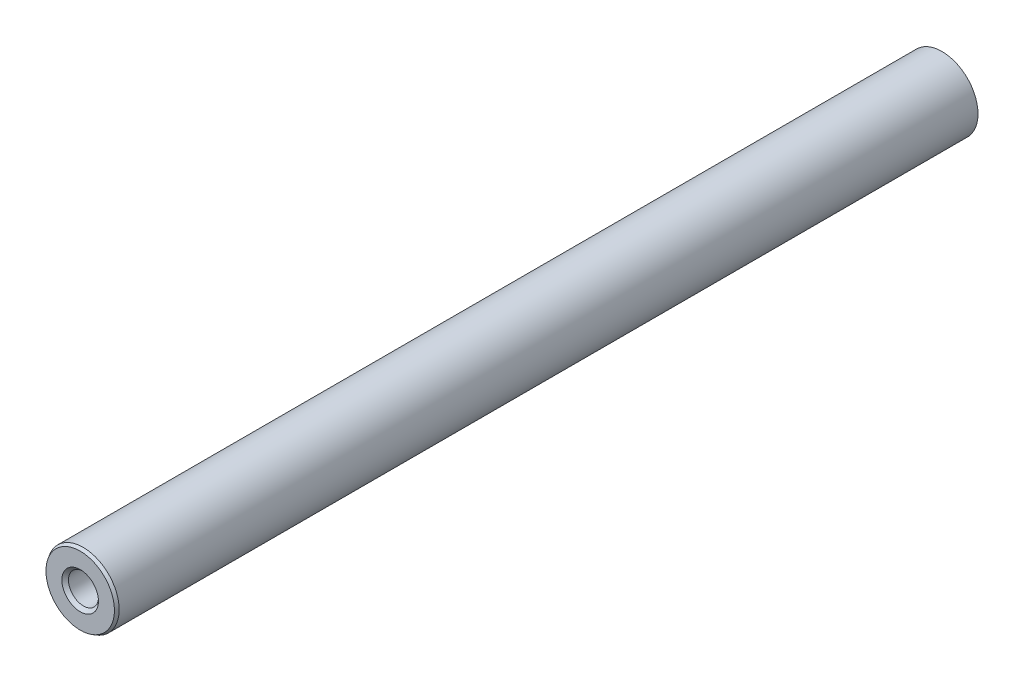
ISO-10303-21;
HEADER;
FILE_DESCRIPTION(('STEP AP214'),'2;1');
FILE_NAME('part.step','',(''),(''),'','','');
FILE_SCHEMA(('AUTOMOTIVE_DESIGN { 1 0 10303 214 1 1 1 1 }'));
ENDSEC;
DATA;
#1=APPLICATION_CONTEXT('core data for automotive mechanical design processes');
#2=APPLICATION_PROTOCOL_DEFINITION('international standard','automotive_design',2000,#1);
#3=PRODUCT_CONTEXT('',#1,'mechanical');
#4=PRODUCT('Part','Part','',(#3));
#5=PRODUCT_RELATED_PRODUCT_CATEGORY('part','',(#4));
#6=PRODUCT_DEFINITION_FORMATION('','',#4);
#7=PRODUCT_DEFINITION_CONTEXT('part definition',#1,'design');
#8=PRODUCT_DEFINITION('design','',#6,#7);
#9=PRODUCT_DEFINITION_SHAPE('','',#8);
#10=(LENGTH_UNIT() NAMED_UNIT(*) SI_UNIT(.MILLI.,.METRE.));
#11=(NAMED_UNIT(*) PLANE_ANGLE_UNIT() SI_UNIT($,.RADIAN.));
#12=(NAMED_UNIT(*) SI_UNIT($,.STERADIAN.) SOLID_ANGLE_UNIT());
#13=UNCERTAINTY_MEASURE_WITH_UNIT(LENGTH_MEASURE(1.E-05),#10,'distance_accuracy_value','');
#14=(GEOMETRIC_REPRESENTATION_CONTEXT(3) GLOBAL_UNCERTAINTY_ASSIGNED_CONTEXT((#13)) GLOBAL_UNIT_ASSIGNED_CONTEXT((#10,
#11,#12)) REPRESENTATION_CONTEXT('',''));
#15=CARTESIAN_POINT('',(0.,0.,0.));
#16=DIRECTION('',(0.,0.,1.));
#17=DIRECTION('',(1.,0.,0.));
#18=AXIS2_PLACEMENT_3D('',#15,#16,#17);
#19=CARTESIAN_POINT('',(0.,0.,36.));
#20=DIRECTION('',(0.,0.,-1.));
#21=DIRECTION('',(-1.,0.,0.));
#22=AXIS2_PLACEMENT_3D('',#19,#20,#21);
#23=CYLINDRICAL_SURFACE('',#22,3.);
#24=CARTESIAN_POINT('',(0.,0.,-35.8556624327026));
#25=DIRECTION('',(0.,0.,1.));
#26=DIRECTION('',(1.,0.,0.));
#27=AXIS2_PLACEMENT_3D('',#24,#25,#26);
#28=CIRCLE('',#27,3.);
#29=CARTESIAN_POINT('',(3.,0.,-35.8556624327026));
#30=VERTEX_POINT('',#29);
#31=EDGE_CURVE('E81',#30,#30,#28,.T.);
#32=ORIENTED_EDGE('',*,*,#31,.T.);
#33=EDGE_LOOP('',(#32));
#34=FACE_BOUND('',#33,.T.);
#35=CARTESIAN_POINT('',(0.,0.,35.75));
#36=DIRECTION('',(0.,0.,1.));
#37=DIRECTION('',(1.,0.,0.));
#38=AXIS2_PLACEMENT_3D('',#35,#36,#37);
#39=CIRCLE('',#38,3.);
#40=CARTESIAN_POINT('',(3.,0.,35.75));
#41=VERTEX_POINT('',#40);
#42=EDGE_CURVE('E78',#41,#41,#39,.F.);
#43=ORIENTED_EDGE('',*,*,#42,.T.);
#44=EDGE_LOOP('',(#43));
#45=FACE_BOUND('',#44,.T.);
#46=ADVANCED_FACE('F38',(#34,#45),#23,.T.);
#47=CARTESIAN_POINT('',(0.,0.,36.));
#48=DIRECTION('',(0.,0.,1.));
#49=DIRECTION('',(1.,0.,0.));
#50=AXIS2_PLACEMENT_3D('',#47,#48,#49);
#51=PLANE('',#50);
#52=CARTESIAN_POINT('',(0.,0.,36.));
#53=DIRECTION('',(0.,0.,1.));
#54=DIRECTION('',(1.,0.,0.));
#55=AXIS2_PLACEMENT_3D('',#52,#53,#54);
#56=CIRCLE('',#55,1.525);
#57=CARTESIAN_POINT('',(1.525,0.,36.));
#58=VERTEX_POINT('',#57);
#59=EDGE_CURVE('E62',#58,#58,#56,.T.);
#60=ORIENTED_EDGE('',*,*,#59,.F.);
#61=EDGE_LOOP('',(#60));
#62=FACE_BOUND('',#61,.T.);
#63=CARTESIAN_POINT('',(0.,0.,36.));
#64=DIRECTION('',(0.,0.,1.));
#65=DIRECTION('',(1.,0.,0.));
#66=AXIS2_PLACEMENT_3D('',#63,#64,#65);
#67=CIRCLE('',#66,2.8556624327026);
#68=CARTESIAN_POINT('',(2.8556624327026,0.,36.));
#69=VERTEX_POINT('',#68);
#70=EDGE_CURVE('E11',#69,#69,#67,.T.);
#71=ORIENTED_EDGE('',*,*,#70,.T.);
#72=EDGE_LOOP('',(#71));
#73=FACE_BOUND('',#72,.T.);
#74=ADVANCED_FACE('F95',(#62,#73),#51,.T.);
#75=CARTESIAN_POINT('',(0.,0.,-36.));
#76=DIRECTION('',(0.,0.,1.));
#77=DIRECTION('',(1.,0.,0.));
#78=AXIS2_PLACEMENT_3D('',#75,#76,#77);
#79=PLANE('',#78);
#80=CARTESIAN_POINT('',(0.,0.,-36.));
#81=DIRECTION('',(0.,0.,-1.));
#82=DIRECTION('',(-1.,0.,0.));
#83=AXIS2_PLACEMENT_3D('',#80,#81,#82);
#84=CIRCLE('',#83,1.525);
#85=CARTESIAN_POINT('',(-1.525,0.,-36.));
#86=VERTEX_POINT('',#85);
#87=EDGE_CURVE('E69',#86,#86,#84,.T.);
#88=ORIENTED_EDGE('',*,*,#87,.F.);
#89=EDGE_LOOP('',(#88));
#90=FACE_BOUND('',#89,.T.);
#91=CARTESIAN_POINT('',(0.,0.,-36.));
#92=DIRECTION('',(0.,0.,1.));
#93=DIRECTION('',(1.,0.,0.));
#94=AXIS2_PLACEMENT_3D('',#91,#92,#93);
#95=CIRCLE('',#94,2.75000000000002);
#96=CARTESIAN_POINT('',(2.75000000000002,0.,-36.));
#97=VERTEX_POINT('',#96);
#98=EDGE_CURVE('E46',#97,#97,#95,.F.);
#99=ORIENTED_EDGE('',*,*,#98,.T.);
#100=EDGE_LOOP('',(#99));
#101=FACE_BOUND('',#100,.T.);
#102=ADVANCED_FACE('F86',(#90,#101),#79,.F.);
#103=CARTESIAN_POINT('',(0.,0.,-35.8556624327026));
#104=DIRECTION('',(0.,0.,1.));
#105=DIRECTION('',(1.,0.,0.));
#106=AXIS2_PLACEMENT_3D('',#103,#104,#105);
#107=CONICAL_SURFACE('',#106,3.,1.0471975511966);
#108=ORIENTED_EDGE('',*,*,#98,.F.);
#109=EDGE_LOOP('',(#108));
#110=FACE_BOUND('',#109,.T.);
#111=ORIENTED_EDGE('',*,*,#31,.F.);
#112=EDGE_LOOP('',(#111));
#113=FACE_BOUND('',#112,.T.);
#114=ADVANCED_FACE('F88',(#110,#113),#107,.T.);
#115=CARTESIAN_POINT('',(0.,0.,36.));
#116=DIRECTION('',(0.,0.,-1.));
#117=DIRECTION('',(-1.,0.,0.));
#118=AXIS2_PLACEMENT_3D('',#115,#116,#117);
#119=CONICAL_SURFACE('',#118,2.8556624327026,0.523598775598299);
#120=ORIENTED_EDGE('',*,*,#42,.F.);
#121=EDGE_LOOP('',(#120));
#122=FACE_BOUND('',#121,.T.);
#123=ORIENTED_EDGE('',*,*,#70,.F.);
#124=EDGE_LOOP('',(#123));
#125=FACE_BOUND('',#124,.T.);
#126=ADVANCED_FACE('F40',(#122,#125),#119,.T.);
#127=CARTESIAN_POINT('',(0.,0.,23.5));
#128=DIRECTION('',(0.,0.,1.));
#129=DIRECTION('',(1.,0.,0.));
#130=AXIS2_PLACEMENT_3D('',#127,#128,#129);
#131=CONICAL_SURFACE('',#130,1.25,1.02974425867665);
#132=CARTESIAN_POINT('',(0.,0.,22.7489242262155));
#133=VERTEX_POINT('',#132);
#134=VERTEX_LOOP('',#133);
#135=FACE_BOUND('',#134,.T.);
#136=CARTESIAN_POINT('',(0.,0.,23.5));
#137=DIRECTION('',(0.,0.,1.));
#138=DIRECTION('',(1.,0.,0.));
#139=AXIS2_PLACEMENT_3D('',#136,#137,#138);
#140=CIRCLE('',#139,1.25);
#141=CARTESIAN_POINT('',(1.25,0.,23.5));
#142=VERTEX_POINT('',#141);
#143=EDGE_CURVE('E75',#142,#142,#140,.T.);
#144=ORIENTED_EDGE('',*,*,#143,.T.);
#145=EDGE_LOOP('',(#144));
#146=FACE_BOUND('',#145,.T.);
#147=ADVANCED_FACE('F101',(#135,#146),#131,.F.);
#148=CARTESIAN_POINT('',(0.,0.,36.));
#149=DIRECTION('',(0.,0.,1.));
#150=DIRECTION('',(1.,0.,0.));
#151=AXIS2_PLACEMENT_3D('',#148,#149,#150);
#152=CYLINDRICAL_SURFACE('',#151,1.24999999999999);
#153=ORIENTED_EDGE('',*,*,#143,.F.);
#154=EDGE_LOOP('',(#153));
#155=FACE_BOUND('',#154,.T.);
#156=CARTESIAN_POINT('',(0.,0.,35.725));
#157=DIRECTION('',(0.,0.,1.));
#158=DIRECTION('',(1.,0.,0.));
#159=AXIS2_PLACEMENT_3D('',#156,#157,#158);
#160=CIRCLE('',#159,1.24999999999999);
#161=CARTESIAN_POINT('',(1.24999999999999,0.,35.725));
#162=VERTEX_POINT('',#161);
#163=EDGE_CURVE('E66',#162,#162,#160,.T.);
#164=ORIENTED_EDGE('',*,*,#163,.T.);
#165=EDGE_LOOP('',(#164));
#166=FACE_BOUND('',#165,.T.);
#167=ADVANCED_FACE('F116',(#155,#166),#152,.F.);
#168=CARTESIAN_POINT('',(0.,0.,36.));
#169=DIRECTION('',(0.,0.,1.));
#170=DIRECTION('',(1.,0.,0.));
#171=AXIS2_PLACEMENT_3D('',#168,#169,#170);
#172=CONICAL_SURFACE('',#171,1.525,0.785398163397474);
#173=ORIENTED_EDGE('',*,*,#163,.F.);
#174=EDGE_LOOP('',(#173));
#175=FACE_BOUND('',#174,.T.);
#176=ORIENTED_EDGE('',*,*,#59,.T.);
#177=EDGE_LOOP('',(#176));
#178=FACE_BOUND('',#177,.T.);
#179=ADVANCED_FACE('F56',(#175,#178),#172,.F.);
#180=CARTESIAN_POINT('',(0.,0.,-23.5));
#181=DIRECTION('',(0.,0.,-1.));
#182=DIRECTION('',(-1.,0.,0.));
#183=AXIS2_PLACEMENT_3D('',#180,#181,#182);
#184=CONICAL_SURFACE('',#183,1.25,1.02974425867665);
#185=CARTESIAN_POINT('',(0.,0.,-22.7489242262155));
#186=VERTEX_POINT('',#185);
#187=VERTEX_LOOP('',#186);
#188=FACE_BOUND('',#187,.T.);
#189=CARTESIAN_POINT('',(0.,0.,-23.5));
#190=DIRECTION('',(0.,0.,-1.));
#191=DIRECTION('',(-1.,0.,0.));
#192=AXIS2_PLACEMENT_3D('',#189,#190,#191);
#193=CIRCLE('',#192,1.25);
#194=CARTESIAN_POINT('',(-1.25,0.,-23.5));
#195=VERTEX_POINT('',#194);
#196=EDGE_CURVE('E60',#195,#195,#193,.T.);
#197=ORIENTED_EDGE('',*,*,#196,.T.);
#198=EDGE_LOOP('',(#197));
#199=FACE_BOUND('',#198,.T.);
#200=ADVANCED_FACE('F52',(#188,#199),#184,.F.);
#201=CARTESIAN_POINT('',(0.,0.,-36.));
#202=DIRECTION('',(0.,0.,-1.));
#203=DIRECTION('',(-1.,0.,0.));
#204=AXIS2_PLACEMENT_3D('',#201,#202,#203);
#205=CYLINDRICAL_SURFACE('',#204,1.24999999999999);
#206=ORIENTED_EDGE('',*,*,#196,.F.);
#207=EDGE_LOOP('',(#206));
#208=FACE_BOUND('',#207,.T.);
#209=CARTESIAN_POINT('',(0.,0.,-35.725));
#210=DIRECTION('',(0.,0.,-1.));
#211=DIRECTION('',(-1.,0.,0.));
#212=AXIS2_PLACEMENT_3D('',#209,#210,#211);
#213=CIRCLE('',#212,1.24999999999999);
#214=CARTESIAN_POINT('',(-1.24999999999999,0.,-35.725));
#215=VERTEX_POINT('',#214);
#216=EDGE_CURVE('E63',#215,#215,#213,.T.);
#217=ORIENTED_EDGE('',*,*,#216,.T.);
#218=EDGE_LOOP('',(#217));
#219=FACE_BOUND('',#218,.T.);
#220=ADVANCED_FACE('F55',(#208,#219),#205,.F.);
#221=CARTESIAN_POINT('',(0.,0.,-36.));
#222=DIRECTION('',(0.,0.,-1.));
#223=DIRECTION('',(-1.,0.,0.));
#224=AXIS2_PLACEMENT_3D('',#221,#222,#223);
#225=CONICAL_SURFACE('',#224,1.525,0.785398163397474);
#226=ORIENTED_EDGE('',*,*,#216,.F.);
#227=EDGE_LOOP('',(#226));
#228=FACE_BOUND('',#227,.T.);
#229=ORIENTED_EDGE('',*,*,#87,.T.);
#230=EDGE_LOOP('',(#229));
#231=FACE_BOUND('',#230,.T.);
#232=ADVANCED_FACE('F125',(#228,#231),#225,.F.);
#233=CLOSED_SHELL('',(#46,#74,#102,#114,#126,#147,#167,#179,#200,#220,#232));
#234=MANIFOLD_SOLID_BREP('B2',#233);
#235=ADVANCED_BREP_SHAPE_REPRESENTATION('',(#18,#234),#14);
#236=SHAPE_DEFINITION_REPRESENTATION(#9,#235);
ENDSEC;
END-ISO-10303-21;
